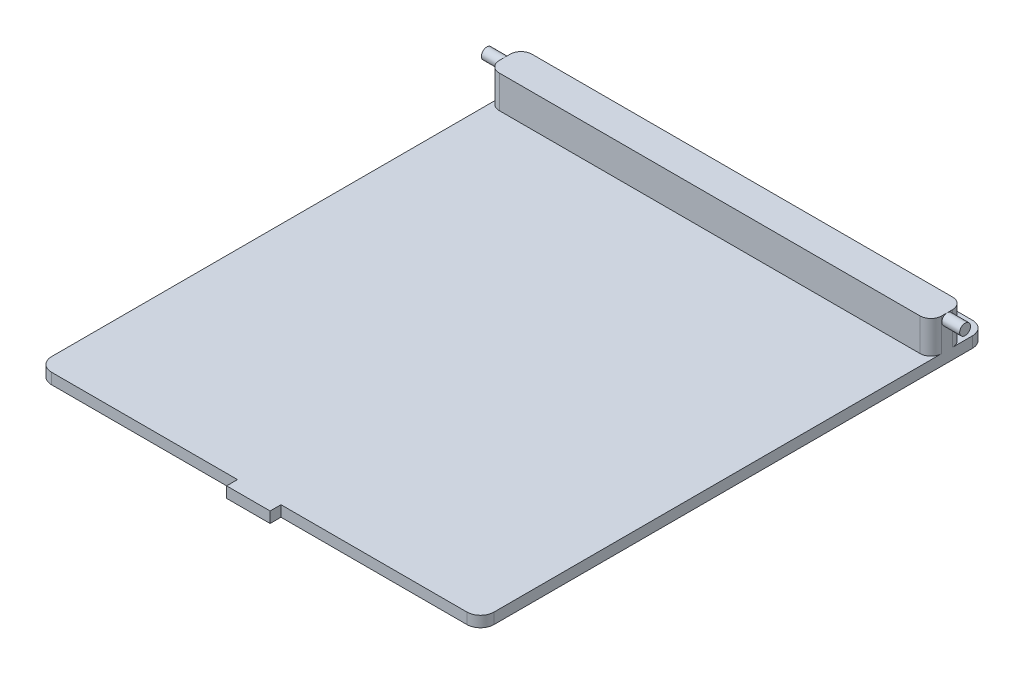
ISO-10303-21;
HEADER;
FILE_DESCRIPTION(('STEP AP214'),'2;1');
FILE_NAME('part.step','',(''),(''),'','','');
FILE_SCHEMA(('AUTOMOTIVE_DESIGN { 1 0 10303 214 1 1 1 1 }'));
ENDSEC;
DATA;
#1=APPLICATION_CONTEXT('core data for automotive mechanical design processes');
#2=APPLICATION_PROTOCOL_DEFINITION('international standard','automotive_design',2000,#1);
#3=PRODUCT_CONTEXT('',#1,'mechanical');
#4=PRODUCT('Part','Part','',(#3));
#5=PRODUCT_RELATED_PRODUCT_CATEGORY('part','',(#4));
#6=PRODUCT_DEFINITION_FORMATION('','',#4);
#7=PRODUCT_DEFINITION_CONTEXT('part definition',#1,'design');
#8=PRODUCT_DEFINITION('design','',#6,#7);
#9=PRODUCT_DEFINITION_SHAPE('','',#8);
#10=(LENGTH_UNIT() NAMED_UNIT(*) SI_UNIT(.MILLI.,.METRE.));
#11=(NAMED_UNIT(*) PLANE_ANGLE_UNIT() SI_UNIT($,.RADIAN.));
#12=(NAMED_UNIT(*) SI_UNIT($,.STERADIAN.) SOLID_ANGLE_UNIT());
#13=UNCERTAINTY_MEASURE_WITH_UNIT(LENGTH_MEASURE(1.E-05),#10,'distance_accuracy_value','');
#14=(GEOMETRIC_REPRESENTATION_CONTEXT(3) GLOBAL_UNCERTAINTY_ASSIGNED_CONTEXT((#13)) GLOBAL_UNIT_ASSIGNED_CONTEXT((#10,
#11,#12)) REPRESENTATION_CONTEXT('',''));
#15=CARTESIAN_POINT('',(0.,0.,0.));
#16=DIRECTION('',(0.,0.,1.));
#17=DIRECTION('',(1.,0.,0.));
#18=AXIS2_PLACEMENT_3D('',#15,#16,#17);
#19=CARTESIAN_POINT('',(-40.7,-5.,85.86));
#20=DIRECTION('',(0.,0.,-1.));
#21=DIRECTION('',(-1.,0.,0.));
#22=AXIS2_PLACEMENT_3D('',#19,#20,#21);
#23=PLANE('',#22);
#24=DIRECTION('',(-1.,0.,0.));
#25=VECTOR('',#24,1.);
#26=CARTESIAN_POINT('',(-40.7,-3.,85.86));
#27=LINE('',#26,#25);
#28=CARTESIAN_POINT('',(38.2,-3.,85.86));
#29=VERTEX_POINT('',#28);
#30=CARTESIAN_POINT('',(4.,-3.,85.86));
#31=VERTEX_POINT('',#30);
#32=EDGE_CURVE('E252',#29,#31,#27,.T.);
#33=ORIENTED_EDGE('',*,*,#32,.T.);
#34=DIRECTION('',(0.,-1.,0.));
#35=VECTOR('',#34,1.);
#36=CARTESIAN_POINT('',(4.,-5.,85.86));
#37=LINE('',#36,#35);
#38=CARTESIAN_POINT('',(4.,-5.,85.86));
#39=VERTEX_POINT('',#38);
#40=EDGE_CURVE('E62',#31,#39,#37,.T.);
#41=ORIENTED_EDGE('',*,*,#40,.T.);
#42=DIRECTION('',(-1.,0.,0.));
#43=VECTOR('',#42,1.);
#44=CARTESIAN_POINT('',(-40.7,-5.,85.86));
#45=LINE('',#44,#43);
#46=CARTESIAN_POINT('',(38.2,-5.,85.86));
#47=VERTEX_POINT('',#46);
#48=EDGE_CURVE('E207',#47,#39,#45,.T.);
#49=ORIENTED_EDGE('',*,*,#48,.F.);
#50=DIRECTION('',(0.,1.,0.));
#51=VECTOR('',#50,1.);
#52=CARTESIAN_POINT('',(38.2,-5.,85.86));
#53=LINE('',#52,#51);
#54=EDGE_CURVE('E373',#47,#29,#53,.T.);
#55=ORIENTED_EDGE('',*,*,#54,.T.);
#56=EDGE_LOOP('',(#33,#41,#49,#55));
#57=FACE_BOUND('',#56,.T.);
#58=ADVANCED_FACE('F39',(#57),#23,.F.);
#59=CARTESIAN_POINT('',(-40.7,3.,3.));
#60=DIRECTION('',(1.,0.,0.));
#61=DIRECTION('',(0.,0.,-1.));
#62=AXIS2_PLACEMENT_3D('',#59,#60,#61);
#63=PLANE('',#62);
#64=DIRECTION('',(0.,0.,-1.));
#65=VECTOR('',#64,1.);
#66=CARTESIAN_POINT('',(-40.7,-3.,85.86));
#67=LINE('',#66,#65);
#68=CARTESIAN_POINT('',(-40.7,-3.,-0.999999999999997));
#69=VERTEX_POINT('',#68);
#70=CARTESIAN_POINT('',(-40.7,-3.,-4.63999999999999));
#71=VERTEX_POINT('',#70);
#72=EDGE_CURVE('E254',#69,#71,#67,.T.);
#73=ORIENTED_EDGE('',*,*,#72,.T.);
#74=DIRECTION('',(0.,1.,0.));
#75=VECTOR('',#74,1.);
#76=CARTESIAN_POINT('',(-40.7,3.,-4.64000000000001));
#77=LINE('',#76,#75);
#78=CARTESIAN_POINT('',(-40.7,-5.,-4.63999999999999));
#79=VERTEX_POINT('',#78);
#80=EDGE_CURVE('E358',#71,#79,#77,.F.);
#81=ORIENTED_EDGE('',*,*,#80,.T.);
#82=DIRECTION('',(0.,0.,-1.));
#83=VECTOR('',#82,1.);
#84=CARTESIAN_POINT('',(-40.7,-5.,85.86));
#85=LINE('',#84,#83);
#86=CARTESIAN_POINT('',(-40.7,-5.,83.36));
#87=VERTEX_POINT('',#86);
#88=EDGE_CURVE('E242',#87,#79,#85,.T.);
#89=ORIENTED_EDGE('',*,*,#88,.F.);
#90=DIRECTION('',(0.,1.,0.));
#91=VECTOR('',#90,1.);
#92=CARTESIAN_POINT('',(-40.7000000000001,3.,83.36));
#93=LINE('',#92,#91);
#94=CARTESIAN_POINT('',(-40.7,-3.,83.36));
#95=VERTEX_POINT('',#94);
#96=EDGE_CURVE('E355',#87,#95,#93,.T.);
#97=ORIENTED_EDGE('',*,*,#96,.T.);
#98=CARTESIAN_POINT('',(-40.7,-3.,1.));
#99=VERTEX_POINT('',#98);
#100=EDGE_CURVE('E255',#95,#99,#67,.T.);
#101=ORIENTED_EDGE('',*,*,#100,.T.);
#102=DIRECTION('',(0.,-1.,0.));
#103=VECTOR('',#102,1.);
#104=CARTESIAN_POINT('',(-40.7,3.,1.));
#105=LINE('',#104,#103);
#106=CARTESIAN_POINT('',(-40.7,2.,1.));
#107=VERTEX_POINT('',#106);
#108=EDGE_CURVE('E321',#99,#107,#105,.F.);
#109=ORIENTED_EDGE('',*,*,#108,.T.);
#110=CARTESIAN_POINT('',(-40.7,2.,0.));
#111=DIRECTION('',(1.,0.,0.));
#112=DIRECTION('',(0.,0.,-1.));
#113=AXIS2_PLACEMENT_3D('',#110,#111,#112);
#114=CIRCLE('',#113,1.);
#115=CARTESIAN_POINT('',(-40.7,2.,-0.999999999999996));
#116=VERTEX_POINT('',#115);
#117=EDGE_CURVE('E274',#116,#107,#114,.F.);
#118=ORIENTED_EDGE('',*,*,#117,.F.);
#119=DIRECTION('',(0.,-1.,0.));
#120=VECTOR('',#119,1.);
#121=CARTESIAN_POINT('',(-40.7,3.,-0.999999999999997));
#122=LINE('',#121,#120);
#123=EDGE_CURVE('E317',#116,#69,#122,.T.);
#124=ORIENTED_EDGE('',*,*,#123,.T.);
#125=EDGE_LOOP('',(#73,#81,#89,#97,#101,#109,#118,#124));
#126=FACE_BOUND('',#125,.T.);
#127=ADVANCED_FACE('F460',(#126),#63,.F.);
#128=CARTESIAN_POINT('',(-40.7,3.,0.));
#129=VERTEX_POINT('',#128);
#130=EDGE_CURVE('E275',#107,#129,#114,.F.);
#131=ORIENTED_EDGE('',*,*,#130,.F.);
#132=CARTESIAN_POINT('',(-40.7,3.,1.));
#133=VERTEX_POINT('',#132);
#134=EDGE_CURVE('E320',#107,#133,#105,.F.);
#135=ORIENTED_EDGE('',*,*,#134,.T.);
#136=DIRECTION('',(0.,0.,1.));
#137=VECTOR('',#136,1.);
#138=CARTESIAN_POINT('',(-40.7,3.,3.));
#139=LINE('',#138,#137);
#140=EDGE_CURVE('E280',#129,#133,#139,.T.);
#141=ORIENTED_EDGE('',*,*,#140,.F.);
#142=EDGE_LOOP('',(#131,#135,#141));
#143=FACE_BOUND('',#142,.T.);
#144=ADVANCED_FACE('F483',(#143),#63,.F.);
#145=CARTESIAN_POINT('',(40.7,3.,3.));
#146=DIRECTION('',(-1.,0.,0.));
#147=DIRECTION('',(0.,0.,1.));
#148=AXIS2_PLACEMENT_3D('',#145,#146,#147);
#149=PLANE('',#148);
#150=DIRECTION('',(0.,0.,1.));
#151=VECTOR('',#150,1.);
#152=CARTESIAN_POINT('',(40.7,-3.,85.86));
#153=LINE('',#152,#151);
#154=CARTESIAN_POINT('',(40.7,-3.,0.999999999999996));
#155=VERTEX_POINT('',#154);
#156=CARTESIAN_POINT('',(40.7,-3.,83.36));
#157=VERTEX_POINT('',#156);
#158=EDGE_CURVE('E235',#155,#157,#153,.T.);
#159=ORIENTED_EDGE('',*,*,#158,.T.);
#160=DIRECTION('',(0.,1.,0.));
#161=VECTOR('',#160,1.);
#162=CARTESIAN_POINT('',(40.7,3.,83.36));
#163=LINE('',#162,#161);
#164=CARTESIAN_POINT('',(40.7,-5.,83.36));
#165=VERTEX_POINT('',#164);
#166=EDGE_CURVE('E11',#157,#165,#163,.F.);
#167=ORIENTED_EDGE('',*,*,#166,.T.);
#168=DIRECTION('',(0.,0.,1.));
#169=VECTOR('',#168,1.);
#170=CARTESIAN_POINT('',(40.7,-5.,85.86));
#171=LINE('',#170,#169);
#172=CARTESIAN_POINT('',(40.7,-5.,-4.63999999999998));
#173=VERTEX_POINT('',#172);
#174=EDGE_CURVE('E236',#173,#165,#171,.T.);
#175=ORIENTED_EDGE('',*,*,#174,.F.);
#176=DIRECTION('',(0.,1.,0.));
#177=VECTOR('',#176,1.);
#178=CARTESIAN_POINT('',(40.7,3.,-4.64000000000001));
#179=LINE('',#178,#177);
#180=CARTESIAN_POINT('',(40.7,-3.,-4.63999999999998));
#181=VERTEX_POINT('',#180);
#182=EDGE_CURVE('E47',#173,#181,#179,.T.);
#183=ORIENTED_EDGE('',*,*,#182,.T.);
#184=CARTESIAN_POINT('',(40.7,-3.,-1.));
#185=VERTEX_POINT('',#184);
#186=EDGE_CURVE('E249',#181,#185,#153,.T.);
#187=ORIENTED_EDGE('',*,*,#186,.T.);
#188=DIRECTION('',(0.,-1.,0.));
#189=VECTOR('',#188,1.);
#190=CARTESIAN_POINT('',(40.7,3.,-1.));
#191=LINE('',#190,#189);
#192=CARTESIAN_POINT('',(40.7,2.,-1.));
#193=VERTEX_POINT('',#192);
#194=EDGE_CURVE('E334',#185,#193,#191,.F.);
#195=ORIENTED_EDGE('',*,*,#194,.T.);
#196=CARTESIAN_POINT('',(40.7,2.,0.));
#197=DIRECTION('',(-1.,0.,0.));
#198=DIRECTION('',(0.,0.,1.));
#199=AXIS2_PLACEMENT_3D('',#196,#197,#198);
#200=CIRCLE('',#199,1.);
#201=CARTESIAN_POINT('',(40.7,2.,0.999999999999995));
#202=VERTEX_POINT('',#201);
#203=EDGE_CURVE('E269',#202,#193,#200,.F.);
#204=ORIENTED_EDGE('',*,*,#203,.F.);
#205=DIRECTION('',(0.,-1.,0.));
#206=VECTOR('',#205,1.);
#207=CARTESIAN_POINT('',(40.7,3.,0.999999999999996));
#208=LINE('',#207,#206);
#209=EDGE_CURVE('E337',#202,#155,#208,.T.);
#210=ORIENTED_EDGE('',*,*,#209,.T.);
#211=EDGE_LOOP('',(#159,#167,#175,#183,#187,#195,#204,#210));
#212=FACE_BOUND('',#211,.T.);
#213=ADVANCED_FACE('F383',(#212),#149,.F.);
#214=CARTESIAN_POINT('',(40.7,3.,0.));
#215=VERTEX_POINT('',#214);
#216=EDGE_CURVE('E270',#193,#215,#200,.F.);
#217=ORIENTED_EDGE('',*,*,#216,.F.);
#218=CARTESIAN_POINT('',(40.7,3.,-1.));
#219=VERTEX_POINT('',#218);
#220=EDGE_CURVE('E333',#193,#219,#191,.F.);
#221=ORIENTED_EDGE('',*,*,#220,.T.);
#222=DIRECTION('',(0.,0.,-1.));
#223=VECTOR('',#222,1.);
#224=CARTESIAN_POINT('',(40.7,3.,3.));
#225=LINE('',#224,#223);
#226=EDGE_CURVE('E284',#215,#219,#225,.T.);
#227=ORIENTED_EDGE('',*,*,#226,.F.);
#228=EDGE_LOOP('',(#217,#221,#227));
#229=FACE_BOUND('',#228,.T.);
#230=ADVANCED_FACE('F475',(#229),#149,.F.);
#231=EDGE_CURVE('E271',#129,#116,#114,.F.);
#232=ORIENTED_EDGE('',*,*,#231,.F.);
#233=CARTESIAN_POINT('',(-40.7,3.,-0.999999999999997));
#234=VERTEX_POINT('',#233);
#235=EDGE_CURVE('E276',#234,#129,#139,.T.);
#236=ORIENTED_EDGE('',*,*,#235,.F.);
#237=EDGE_CURVE('E318',#234,#116,#122,.T.);
#238=ORIENTED_EDGE('',*,*,#237,.T.);
#239=EDGE_LOOP('',(#232,#236,#238));
#240=FACE_BOUND('',#239,.T.);
#241=ADVANCED_FACE('F411',(#240),#63,.F.);
#242=CARTESIAN_POINT('',(40.7,3.,3.));
#243=DIRECTION('',(0.,0.,-1.));
#244=DIRECTION('',(-1.,0.,0.));
#245=AXIS2_PLACEMENT_3D('',#242,#243,#244);
#246=PLANE('',#245);
#247=DIRECTION('',(1.,0.,0.));
#248=VECTOR('',#247,1.);
#249=CARTESIAN_POINT('',(40.7,3.,3.));
#250=LINE('',#249,#248);
#251=CARTESIAN_POINT('',(-38.7,3.,3.));
#252=VERTEX_POINT('',#251);
#253=CARTESIAN_POINT('',(38.7,3.,3.));
#254=VERTEX_POINT('',#253);
#255=EDGE_CURVE('E279',#252,#254,#250,.T.);
#256=ORIENTED_EDGE('',*,*,#255,.F.);
#257=DIRECTION('',(0.,-1.,0.));
#258=VECTOR('',#257,1.);
#259=CARTESIAN_POINT('',(-38.7,3.,3.));
#260=LINE('',#259,#258);
#261=CARTESIAN_POINT('',(-38.7,-3.,3.));
#262=VERTEX_POINT('',#261);
#263=EDGE_CURVE('E301',#252,#262,#260,.T.);
#264=ORIENTED_EDGE('',*,*,#263,.T.);
#265=DIRECTION('',(1.,0.,0.));
#266=VECTOR('',#265,1.);
#267=CARTESIAN_POINT('',(40.7,-3.,3.));
#268=LINE('',#267,#266);
#269=CARTESIAN_POINT('',(38.7,-3.,3.));
#270=VERTEX_POINT('',#269);
#271=EDGE_CURVE('E293',#262,#270,#268,.T.);
#272=ORIENTED_EDGE('',*,*,#271,.T.);
#273=DIRECTION('',(0.,-1.,0.));
#274=VECTOR('',#273,1.);
#275=CARTESIAN_POINT('',(38.7,3.,3.));
#276=LINE('',#275,#274);
#277=EDGE_CURVE('E292',#270,#254,#276,.F.);
#278=ORIENTED_EDGE('',*,*,#277,.T.);
#279=EDGE_LOOP('',(#256,#264,#272,#278));
#280=FACE_BOUND('',#279,.T.);
#281=ADVANCED_FACE('F468',(#280),#246,.F.);
#282=EDGE_CURVE('E263',#215,#202,#200,.F.);
#283=ORIENTED_EDGE('',*,*,#282,.F.);
#284=CARTESIAN_POINT('',(40.7,3.,0.999999999999996));
#285=VERTEX_POINT('',#284);
#286=EDGE_CURVE('E285',#285,#215,#225,.T.);
#287=ORIENTED_EDGE('',*,*,#286,.F.);
#288=EDGE_CURVE('E338',#285,#202,#208,.T.);
#289=ORIENTED_EDGE('',*,*,#288,.T.);
#290=EDGE_LOOP('',(#283,#287,#289));
#291=FACE_BOUND('',#290,.T.);
#292=ADVANCED_FACE('F471',(#291),#149,.F.);
#293=CARTESIAN_POINT('',(40.7,3.,-3.));
#294=DIRECTION('',(0.,0.,1.));
#295=DIRECTION('',(1.,0.,0.));
#296=AXIS2_PLACEMENT_3D('',#293,#294,#295);
#297=PLANE('',#296);
#298=DIRECTION('',(-1.,0.,0.));
#299=VECTOR('',#298,1.);
#300=CARTESIAN_POINT('',(40.7,3.,-3.));
#301=LINE('',#300,#299);
#302=CARTESIAN_POINT('',(38.7,3.,-3.));
#303=VERTEX_POINT('',#302);
#304=CARTESIAN_POINT('',(-38.7,3.,-2.99999999999999));
#305=VERTEX_POINT('',#304);
#306=EDGE_CURVE('E289',#303,#305,#301,.T.);
#307=ORIENTED_EDGE('',*,*,#306,.F.);
#308=DIRECTION('',(0.,-1.,0.));
#309=VECTOR('',#308,1.);
#310=CARTESIAN_POINT('',(38.7,3.,-3.));
#311=LINE('',#310,#309);
#312=CARTESIAN_POINT('',(38.7,-3.,-3.));
#313=VERTEX_POINT('',#312);
#314=EDGE_CURVE('E343',#303,#313,#311,.T.);
#315=ORIENTED_EDGE('',*,*,#314,.T.);
#316=DIRECTION('',(-1.,0.,0.));
#317=VECTOR('',#316,1.);
#318=CARTESIAN_POINT('',(40.7,-3.,-3.));
#319=LINE('',#318,#317);
#320=CARTESIAN_POINT('',(-38.7,-3.,-2.99999999999999));
#321=VERTEX_POINT('',#320);
#322=EDGE_CURVE('E297',#313,#321,#319,.T.);
#323=ORIENTED_EDGE('',*,*,#322,.T.);
#324=DIRECTION('',(0.,-1.,0.));
#325=VECTOR('',#324,1.);
#326=CARTESIAN_POINT('',(-38.7,3.,-2.99999999999999));
#327=LINE('',#326,#325);
#328=EDGE_CURVE('E341',#321,#305,#327,.F.);
#329=ORIENTED_EDGE('',*,*,#328,.T.);
#330=EDGE_LOOP('',(#307,#315,#323,#329));
#331=FACE_BOUND('',#330,.T.);
#332=ADVANCED_FACE('F398',(#331),#297,.F.);
#333=CARTESIAN_POINT('',(0.,3.,0.));
#334=DIRECTION('',(0.,1.,0.));
#335=DIRECTION('',(0.,0.,1.));
#336=AXIS2_PLACEMENT_3D('',#333,#334,#335);
#337=PLANE('',#336);
#338=ORIENTED_EDGE('',*,*,#286,.T.);
#339=ORIENTED_EDGE('',*,*,#226,.T.);
#340=CARTESIAN_POINT('',(38.7,3.,-1.));
#341=DIRECTION('',(0.,1.,0.));
#342=DIRECTION('',(0.,0.,1.));
#343=AXIS2_PLACEMENT_3D('',#340,#341,#342);
#344=CIRCLE('',#343,2.);
#345=EDGE_CURVE('E326',#219,#303,#344,.T.);
#346=ORIENTED_EDGE('',*,*,#345,.T.);
#347=ORIENTED_EDGE('',*,*,#306,.T.);
#348=CARTESIAN_POINT('',(-38.7,3.,-0.999999999999994));
#349=DIRECTION('',(0.,1.,0.));
#350=DIRECTION('',(0.,0.,1.));
#351=AXIS2_PLACEMENT_3D('',#348,#349,#350);
#352=CIRCLE('',#351,2.);
#353=EDGE_CURVE('E324',#305,#234,#352,.T.);
#354=ORIENTED_EDGE('',*,*,#353,.T.);
#355=ORIENTED_EDGE('',*,*,#235,.T.);
#356=ORIENTED_EDGE('',*,*,#140,.T.);
#357=CARTESIAN_POINT('',(-38.7,3.,1.));
#358=DIRECTION('',(0.,1.,0.));
#359=DIRECTION('',(0.,0.,1.));
#360=AXIS2_PLACEMENT_3D('',#357,#358,#359);
#361=CIRCLE('',#360,2.);
#362=EDGE_CURVE('E331',#133,#252,#361,.T.);
#363=ORIENTED_EDGE('',*,*,#362,.T.);
#364=ORIENTED_EDGE('',*,*,#255,.T.);
#365=CARTESIAN_POINT('',(38.7,3.,0.999999999999996));
#366=DIRECTION('',(0.,1.,0.));
#367=DIRECTION('',(0.,0.,1.));
#368=AXIS2_PLACEMENT_3D('',#365,#366,#367);
#369=CIRCLE('',#368,2.);
#370=EDGE_CURVE('E328',#254,#285,#369,.T.);
#371=ORIENTED_EDGE('',*,*,#370,.T.);
#372=EDGE_LOOP('',(#338,#339,#346,#347,#354,#355,#356,#363,#364,#371));
#373=FACE_BOUND('',#372,.T.);
#374=ADVANCED_FACE('F402',(#373),#337,.T.);
#375=CARTESIAN_POINT('',(-38.7,3.,1.));
#376=DIRECTION('',(0.,-1.,0.));
#377=DIRECTION('',(0.,0.,-1.));
#378=AXIS2_PLACEMENT_3D('',#375,#376,#377);
#379=CYLINDRICAL_SURFACE('',#378,2.);
#380=ORIENTED_EDGE('',*,*,#362,.F.);
#381=ORIENTED_EDGE('',*,*,#134,.F.);
#382=ORIENTED_EDGE('',*,*,#108,.F.);
#383=CARTESIAN_POINT('',(-38.7,-3.,1.));
#384=DIRECTION('',(0.,1.,0.));
#385=DIRECTION('',(0.,0.,1.));
#386=AXIS2_PLACEMENT_3D('',#383,#384,#385);
#387=CIRCLE('',#386,2.);
#388=EDGE_CURVE('E314',#262,#99,#387,.F.);
#389=ORIENTED_EDGE('',*,*,#388,.F.);
#390=ORIENTED_EDGE('',*,*,#263,.F.);
#391=EDGE_LOOP('',(#380,#381,#382,#389,#390));
#392=FACE_BOUND('',#391,.T.);
#393=ADVANCED_FACE('F465',(#392),#379,.T.);
#394=CARTESIAN_POINT('',(38.7,3.,0.999999999999996));
#395=DIRECTION('',(0.,-1.,0.));
#396=DIRECTION('',(0.,0.,-1.));
#397=AXIS2_PLACEMENT_3D('',#394,#395,#396);
#398=CYLINDRICAL_SURFACE('',#397,2.);
#399=ORIENTED_EDGE('',*,*,#370,.F.);
#400=ORIENTED_EDGE('',*,*,#277,.F.);
#401=CARTESIAN_POINT('',(38.7,-3.,0.999999999999996));
#402=DIRECTION('',(0.,1.,0.));
#403=DIRECTION('',(0.,0.,1.));
#404=AXIS2_PLACEMENT_3D('',#401,#402,#403);
#405=CIRCLE('',#404,2.);
#406=EDGE_CURVE('E310',#155,#270,#405,.F.);
#407=ORIENTED_EDGE('',*,*,#406,.F.);
#408=ORIENTED_EDGE('',*,*,#209,.F.);
#409=ORIENTED_EDGE('',*,*,#288,.F.);
#410=EDGE_LOOP('',(#399,#400,#407,#408,#409));
#411=FACE_BOUND('',#410,.T.);
#412=ADVANCED_FACE('F436',(#411),#398,.T.);
#413=CARTESIAN_POINT('',(38.7,3.,-1.));
#414=DIRECTION('',(0.,-1.,0.));
#415=DIRECTION('',(0.,0.,-1.));
#416=AXIS2_PLACEMENT_3D('',#413,#414,#415);
#417=CYLINDRICAL_SURFACE('',#416,2.);
#418=ORIENTED_EDGE('',*,*,#345,.F.);
#419=ORIENTED_EDGE('',*,*,#220,.F.);
#420=ORIENTED_EDGE('',*,*,#194,.F.);
#421=CARTESIAN_POINT('',(38.7,-3.,-1.));
#422=DIRECTION('',(0.,1.,0.));
#423=DIRECTION('',(0.,0.,1.));
#424=AXIS2_PLACEMENT_3D('',#421,#422,#423);
#425=CIRCLE('',#424,2.);
#426=EDGE_CURVE('E307',#313,#185,#425,.F.);
#427=ORIENTED_EDGE('',*,*,#426,.F.);
#428=ORIENTED_EDGE('',*,*,#314,.F.);
#429=EDGE_LOOP('',(#418,#419,#420,#427,#428));
#430=FACE_BOUND('',#429,.T.);
#431=ADVANCED_FACE('F394',(#430),#417,.T.);
#432=CARTESIAN_POINT('',(-38.7,3.,-0.999999999999994));
#433=DIRECTION('',(0.,-1.,0.));
#434=DIRECTION('',(0.,0.,-1.));
#435=AXIS2_PLACEMENT_3D('',#432,#433,#434);
#436=CYLINDRICAL_SURFACE('',#435,2.);
#437=ORIENTED_EDGE('',*,*,#353,.F.);
#438=ORIENTED_EDGE('',*,*,#328,.F.);
#439=CARTESIAN_POINT('',(-38.7,-3.,-0.999999999999994));
#440=DIRECTION('',(0.,1.,0.));
#441=DIRECTION('',(0.,0.,1.));
#442=AXIS2_PLACEMENT_3D('',#439,#440,#441);
#443=CIRCLE('',#442,2.);
#444=EDGE_CURVE('E304',#69,#321,#443,.F.);
#445=ORIENTED_EDGE('',*,*,#444,.F.);
#446=ORIENTED_EDGE('',*,*,#123,.F.);
#447=ORIENTED_EDGE('',*,*,#237,.F.);
#448=EDGE_LOOP('',(#437,#438,#445,#446,#447));
#449=FACE_BOUND('',#448,.T.);
#450=ADVANCED_FACE('F406',(#449),#436,.T.);
#451=CARTESIAN_POINT('',(44.,2.,0.));
#452=DIRECTION('',(1.,0.,0.));
#453=DIRECTION('',(0.,0.,-1.));
#454=AXIS2_PLACEMENT_3D('',#451,#452,#453);
#455=PLANE('',#454);
#456=CARTESIAN_POINT('',(44.,2.,0.));
#457=DIRECTION('',(1.,0.,0.));
#458=DIRECTION('',(0.,0.,-1.));
#459=AXIS2_PLACEMENT_3D('',#456,#457,#458);
#460=CIRCLE('',#459,1.);
#461=CARTESIAN_POINT('',(44.,2.,-1.));
#462=VERTEX_POINT('',#461);
#463=EDGE_CURVE('E259',#462,#462,#460,.T.);
#464=ORIENTED_EDGE('',*,*,#463,.T.);
#465=EDGE_LOOP('',(#464));
#466=FACE_BOUND('',#465,.T.);
#467=ADVANCED_FACE('F620',(#466),#455,.T.);
#468=CARTESIAN_POINT('',(44.,2.,0.));
#469=DIRECTION('',(-1.,0.,0.));
#470=DIRECTION('',(0.,0.,1.));
#471=AXIS2_PLACEMENT_3D('',#468,#469,#470);
#472=CYLINDRICAL_SURFACE('',#471,1.);
#473=ORIENTED_EDGE('',*,*,#463,.F.);
#474=EDGE_LOOP('',(#473));
#475=FACE_BOUND('',#474,.T.);
#476=ORIENTED_EDGE('',*,*,#203,.T.);
#477=ORIENTED_EDGE('',*,*,#216,.T.);
#478=ORIENTED_EDGE('',*,*,#282,.T.);
#479=EDGE_LOOP('',(#476,#477,#478));
#480=FACE_BOUND('',#479,.T.);
#481=ADVANCED_FACE('F427',(#475,#480),#472,.T.);
#482=CARTESIAN_POINT('',(-44.,2.,0.));
#483=DIRECTION('',(1.,0.,0.));
#484=DIRECTION('',(0.,0.,-1.));
#485=AXIS2_PLACEMENT_3D('',#482,#483,#484);
#486=CIRCLE('',#485,1.);
#487=CARTESIAN_POINT('',(-44.,2.,-1.));
#488=VERTEX_POINT('',#487);
#489=EDGE_CURVE('E248',#488,#488,#486,.T.);
#490=ORIENTED_EDGE('',*,*,#489,.T.);
#491=EDGE_LOOP('',(#490));
#492=FACE_BOUND('',#491,.T.);
#493=ORIENTED_EDGE('',*,*,#117,.T.);
#494=ORIENTED_EDGE('',*,*,#130,.T.);
#495=ORIENTED_EDGE('',*,*,#231,.T.);
#496=EDGE_LOOP('',(#493,#494,#495));
#497=FACE_BOUND('',#496,.T.);
#498=ADVANCED_FACE('F417',(#492,#497),#472,.T.);
#499=CARTESIAN_POINT('',(-44.,2.,0.));
#500=DIRECTION('',(1.,0.,0.));
#501=DIRECTION('',(0.,0.,-1.));
#502=AXIS2_PLACEMENT_3D('',#499,#500,#501);
#503=PLANE('',#502);
#504=ORIENTED_EDGE('',*,*,#489,.F.);
#505=EDGE_LOOP('',(#504));
#506=FACE_BOUND('',#505,.T.);
#507=ADVANCED_FACE('F501',(#506),#503,.F.);
#508=CARTESIAN_POINT('',(0.,-3.,0.));
#509=DIRECTION('',(0.,-1.,0.));
#510=DIRECTION('',(0.,0.,-1.));
#511=AXIS2_PLACEMENT_3D('',#508,#509,#510);
#512=PLANE('',#511);
#513=DIRECTION('',(1.,0.,0.));
#514=VECTOR('',#513,1.);
#515=CARTESIAN_POINT('',(-40.7,-3.,-7.14000000000001));
#516=LINE('',#515,#514);
#517=CARTESIAN_POINT('',(-38.2,-3.,-7.14000000000001));
#518=VERTEX_POINT('',#517);
#519=CARTESIAN_POINT('',(38.2,-3.,-7.14000000000001));
#520=VERTEX_POINT('',#519);
#521=EDGE_CURVE('E240',#518,#520,#516,.T.);
#522=ORIENTED_EDGE('',*,*,#521,.F.);
#523=CARTESIAN_POINT('',(-38.2,-3.,-4.64000000000001));
#524=DIRECTION('',(0.,-1.,0.));
#525=DIRECTION('',(0.,0.,-1.));
#526=AXIS2_PLACEMENT_3D('',#523,#524,#525);
#527=CIRCLE('',#526,2.5);
#528=EDGE_CURVE('E353',#518,#71,#527,.F.);
#529=ORIENTED_EDGE('',*,*,#528,.T.);
#530=ORIENTED_EDGE('',*,*,#72,.F.);
#531=ORIENTED_EDGE('',*,*,#444,.T.);
#532=ORIENTED_EDGE('',*,*,#322,.F.);
#533=ORIENTED_EDGE('',*,*,#426,.T.);
#534=ORIENTED_EDGE('',*,*,#186,.F.);
#535=CARTESIAN_POINT('',(38.2,-3.,-4.64000000000001));
#536=DIRECTION('',(0.,-1.,0.));
#537=DIRECTION('',(0.,0.,-1.));
#538=AXIS2_PLACEMENT_3D('',#535,#536,#537);
#539=CIRCLE('',#538,2.5);
#540=EDGE_CURVE('E351',#181,#520,#539,.F.);
#541=ORIENTED_EDGE('',*,*,#540,.T.);
#542=EDGE_LOOP('',(#522,#529,#530,#531,#532,#533,#534,#541));
#543=FACE_BOUND('',#542,.T.);
#544=ADVANCED_FACE('F389',(#543),#512,.F.);
#545=CARTESIAN_POINT('',(-4.,-5.,85.86));
#546=VERTEX_POINT('',#545);
#547=CARTESIAN_POINT('',(-38.2000000000001,-5.,85.86));
#548=VERTEX_POINT('',#547);
#549=EDGE_CURVE('E54',#546,#548,#45,.T.);
#550=ORIENTED_EDGE('',*,*,#549,.F.);
#551=DIRECTION('',(0.,1.,0.));
#552=VECTOR('',#551,1.);
#553=CARTESIAN_POINT('',(-4.,-5.,85.86));
#554=LINE('',#553,#552);
#555=CARTESIAN_POINT('',(-4.,-3.,85.86));
#556=VERTEX_POINT('',#555);
#557=EDGE_CURVE('E232',#546,#556,#554,.T.);
#558=ORIENTED_EDGE('',*,*,#557,.T.);
#559=CARTESIAN_POINT('',(-38.2000000000001,-3.,85.86));
#560=VERTEX_POINT('',#559);
#561=EDGE_CURVE('E251',#556,#560,#27,.T.);
#562=ORIENTED_EDGE('',*,*,#561,.T.);
#563=DIRECTION('',(0.,1.,0.));
#564=VECTOR('',#563,1.);
#565=CARTESIAN_POINT('',(-38.2000000000001,-5.,85.86));
#566=LINE('',#565,#564);
#567=EDGE_CURVE('E376',#560,#548,#566,.F.);
#568=ORIENTED_EDGE('',*,*,#567,.T.);
#569=EDGE_LOOP('',(#550,#558,#562,#568));
#570=FACE_BOUND('',#569,.T.);
#571=ADVANCED_FACE('F453',(#570),#23,.F.);
#572=CARTESIAN_POINT('',(-40.7,-5.,-7.14000000000001));
#573=DIRECTION('',(0.,0.,1.));
#574=DIRECTION('',(1.,0.,0.));
#575=AXIS2_PLACEMENT_3D('',#572,#573,#574);
#576=PLANE('',#575);
#577=DIRECTION('',(1.,0.,0.));
#578=VECTOR('',#577,1.);
#579=CARTESIAN_POINT('',(-40.7,-5.,-7.14000000000001));
#580=LINE('',#579,#578);
#581=CARTESIAN_POINT('',(-38.2,-5.,-7.14000000000001));
#582=VERTEX_POINT('',#581);
#583=CARTESIAN_POINT('',(38.2,-5.,-7.14000000000001));
#584=VERTEX_POINT('',#583);
#585=EDGE_CURVE('E245',#582,#584,#580,.T.);
#586=ORIENTED_EDGE('',*,*,#585,.F.);
#587=DIRECTION('',(0.,1.,0.));
#588=VECTOR('',#587,1.);
#589=CARTESIAN_POINT('',(-38.2,-5.,-7.14000000000001));
#590=LINE('',#589,#588);
#591=EDGE_CURVE('E348',#582,#518,#590,.T.);
#592=ORIENTED_EDGE('',*,*,#591,.T.);
#593=ORIENTED_EDGE('',*,*,#521,.T.);
#594=DIRECTION('',(0.,1.,0.));
#595=VECTOR('',#594,1.);
#596=CARTESIAN_POINT('',(38.2,-5.,-7.14000000000001));
#597=LINE('',#596,#595);
#598=EDGE_CURVE('E346',#520,#584,#597,.F.);
#599=ORIENTED_EDGE('',*,*,#598,.T.);
#600=EDGE_LOOP('',(#586,#592,#593,#599));
#601=FACE_BOUND('',#600,.T.);
#602=ADVANCED_FACE('F495',(#601),#576,.F.);
#603=CARTESIAN_POINT('',(0.,-5.,0.));
#604=DIRECTION('',(0.,-1.,0.));
#605=DIRECTION('',(0.,0.,-1.));
#606=AXIS2_PLACEMENT_3D('',#603,#604,#605);
#607=PLANE('',#606);
#608=ORIENTED_EDGE('',*,*,#48,.T.);
#609=DIRECTION('',(0.,0.,1.));
#610=VECTOR('',#609,1.);
#611=CARTESIAN_POINT('',(4.,-5.,83.8600000000006));
#612=LINE('',#611,#610);
#613=CARTESIAN_POINT('',(4.,-5.,87.8600000000006));
#614=VERTEX_POINT('',#613);
#615=EDGE_CURVE('E201',#39,#614,#612,.T.);
#616=ORIENTED_EDGE('',*,*,#615,.T.);
#617=DIRECTION('',(-1.,0.,0.));
#618=VECTOR('',#617,1.);
#619=CARTESIAN_POINT('',(-4.,-5.,87.8600000000006));
#620=LINE('',#619,#618);
#621=CARTESIAN_POINT('',(-4.,-5.,87.8600000000006));
#622=VERTEX_POINT('',#621);
#623=EDGE_CURVE('E206',#614,#622,#620,.T.);
#624=ORIENTED_EDGE('',*,*,#623,.T.);
#625=DIRECTION('',(0.,0.,-1.));
#626=VECTOR('',#625,1.);
#627=CARTESIAN_POINT('',(-4.,-5.,83.8600000000006));
#628=LINE('',#627,#626);
#629=EDGE_CURVE('E219',#622,#546,#628,.T.);
#630=ORIENTED_EDGE('',*,*,#629,.T.);
#631=ORIENTED_EDGE('',*,*,#549,.T.);
#632=CARTESIAN_POINT('',(-38.2000000000001,-5.,83.36));
#633=DIRECTION('',(0.,-1.,0.));
#634=DIRECTION('',(0.,0.,-1.));
#635=AXIS2_PLACEMENT_3D('',#632,#633,#634);
#636=CIRCLE('',#635,2.5);
#637=EDGE_CURVE('E364',#548,#87,#636,.T.);
#638=ORIENTED_EDGE('',*,*,#637,.T.);
#639=ORIENTED_EDGE('',*,*,#88,.T.);
#640=CARTESIAN_POINT('',(-38.2,-5.,-4.64000000000001));
#641=DIRECTION('',(0.,-1.,0.));
#642=DIRECTION('',(0.,0.,-1.));
#643=AXIS2_PLACEMENT_3D('',#640,#641,#642);
#644=CIRCLE('',#643,2.5);
#645=EDGE_CURVE('E366',#79,#582,#644,.T.);
#646=ORIENTED_EDGE('',*,*,#645,.T.);
#647=ORIENTED_EDGE('',*,*,#585,.T.);
#648=CARTESIAN_POINT('',(38.2,-5.,-4.64000000000001));
#649=DIRECTION('',(0.,-1.,0.));
#650=DIRECTION('',(0.,0.,-1.));
#651=AXIS2_PLACEMENT_3D('',#648,#649,#650);
#652=CIRCLE('',#651,2.5);
#653=EDGE_CURVE('E360',#584,#173,#652,.T.);
#654=ORIENTED_EDGE('',*,*,#653,.T.);
#655=ORIENTED_EDGE('',*,*,#174,.T.);
#656=CARTESIAN_POINT('',(38.2,-5.,83.36));
#657=DIRECTION('',(0.,-1.,0.));
#658=DIRECTION('',(0.,0.,-1.));
#659=AXIS2_PLACEMENT_3D('',#656,#657,#658);
#660=CIRCLE('',#659,2.5);
#661=EDGE_CURVE('E362',#165,#47,#660,.T.);
#662=ORIENTED_EDGE('',*,*,#661,.T.);
#663=EDGE_LOOP('',(#608,#616,#624,#630,#631,#638,#639,#646,#647,#654,#655,#662));
#664=FACE_BOUND('',#663,.T.);
#665=ADVANCED_FACE('F203',(#664),#607,.T.);
#666=ORIENTED_EDGE('',*,*,#561,.F.);
#667=DIRECTION('',(0.,0.,1.));
#668=VECTOR('',#667,1.);
#669=CARTESIAN_POINT('',(-4.,-3.,83.8600000000006));
#670=LINE('',#669,#668);
#671=CARTESIAN_POINT('',(-4.,-3.,87.8600000000006));
#672=VERTEX_POINT('',#671);
#673=EDGE_CURVE('E228',#556,#672,#670,.T.);
#674=ORIENTED_EDGE('',*,*,#673,.T.);
#675=DIRECTION('',(1.,0.,0.));
#676=VECTOR('',#675,1.);
#677=CARTESIAN_POINT('',(-4.,-3.,87.8600000000006));
#678=LINE('',#677,#676);
#679=CARTESIAN_POINT('',(4.,-3.,87.8600000000006));
#680=VERTEX_POINT('',#679);
#681=EDGE_CURVE('E230',#672,#680,#678,.T.);
#682=ORIENTED_EDGE('',*,*,#681,.T.);
#683=DIRECTION('',(0.,0.,-1.));
#684=VECTOR('',#683,1.);
#685=CARTESIAN_POINT('',(4.,-3.,83.8600000000006));
#686=LINE('',#685,#684);
#687=EDGE_CURVE('E215',#680,#31,#686,.T.);
#688=ORIENTED_EDGE('',*,*,#687,.T.);
#689=ORIENTED_EDGE('',*,*,#32,.F.);
#690=CARTESIAN_POINT('',(38.2,-3.,83.36));
#691=DIRECTION('',(0.,-1.,0.));
#692=DIRECTION('',(0.,0.,-1.));
#693=AXIS2_PLACEMENT_3D('',#690,#691,#692);
#694=CIRCLE('',#693,2.5);
#695=EDGE_CURVE('E368',#29,#157,#694,.F.);
#696=ORIENTED_EDGE('',*,*,#695,.T.);
#697=ORIENTED_EDGE('',*,*,#158,.F.);
#698=ORIENTED_EDGE('',*,*,#406,.T.);
#699=ORIENTED_EDGE('',*,*,#271,.F.);
#700=ORIENTED_EDGE('',*,*,#388,.T.);
#701=ORIENTED_EDGE('',*,*,#100,.F.);
#702=CARTESIAN_POINT('',(-38.2000000000001,-3.,83.36));
#703=DIRECTION('',(0.,-1.,0.));
#704=DIRECTION('',(0.,0.,-1.));
#705=AXIS2_PLACEMENT_3D('',#702,#703,#704);
#706=CIRCLE('',#705,2.5);
#707=EDGE_CURVE('E370',#95,#560,#706,.F.);
#708=ORIENTED_EDGE('',*,*,#707,.T.);
#709=EDGE_LOOP('',(#666,#674,#682,#688,#689,#696,#697,#698,#699,#700,#701,#708));
#710=FACE_BOUND('',#709,.T.);
#711=ADVANCED_FACE('F439',(#710),#512,.F.);
#712=CARTESIAN_POINT('',(-38.2,-5.,-4.64000000000001));
#713=DIRECTION('',(0.,1.,0.));
#714=DIRECTION('',(0.,0.,1.));
#715=AXIS2_PLACEMENT_3D('',#712,#713,#714);
#716=CYLINDRICAL_SURFACE('',#715,2.5);
#717=ORIENTED_EDGE('',*,*,#645,.F.);
#718=ORIENTED_EDGE('',*,*,#80,.F.);
#719=ORIENTED_EDGE('',*,*,#528,.F.);
#720=ORIENTED_EDGE('',*,*,#591,.F.);
#721=EDGE_LOOP('',(#717,#718,#719,#720));
#722=FACE_BOUND('',#721,.T.);
#723=ADVANCED_FACE('F510',(#722),#716,.T.);
#724=CARTESIAN_POINT('',(-38.2000000000001,3.,83.36));
#725=DIRECTION('',(0.,1.,0.));
#726=DIRECTION('',(0.,0.,1.));
#727=AXIS2_PLACEMENT_3D('',#724,#725,#726);
#728=CYLINDRICAL_SURFACE('',#727,2.5);
#729=ORIENTED_EDGE('',*,*,#637,.F.);
#730=ORIENTED_EDGE('',*,*,#567,.F.);
#731=ORIENTED_EDGE('',*,*,#707,.F.);
#732=ORIENTED_EDGE('',*,*,#96,.F.);
#733=EDGE_LOOP('',(#729,#730,#731,#732));
#734=FACE_BOUND('',#733,.T.);
#735=ADVANCED_FACE('F456',(#734),#728,.T.);
#736=CARTESIAN_POINT('',(38.2,-5.,83.36));
#737=DIRECTION('',(0.,1.,0.));
#738=DIRECTION('',(0.,0.,1.));
#739=AXIS2_PLACEMENT_3D('',#736,#737,#738);
#740=CYLINDRICAL_SURFACE('',#739,2.5);
#741=ORIENTED_EDGE('',*,*,#661,.F.);
#742=ORIENTED_EDGE('',*,*,#166,.F.);
#743=ORIENTED_EDGE('',*,*,#695,.F.);
#744=ORIENTED_EDGE('',*,*,#54,.F.);
#745=EDGE_LOOP('',(#741,#742,#743,#744));
#746=FACE_BOUND('',#745,.T.);
#747=ADVANCED_FACE('F445',(#746),#740,.T.);
#748=CARTESIAN_POINT('',(38.2,3.,-4.64000000000001));
#749=DIRECTION('',(0.,1.,0.));
#750=DIRECTION('',(0.,0.,1.));
#751=AXIS2_PLACEMENT_3D('',#748,#749,#750);
#752=CYLINDRICAL_SURFACE('',#751,2.5);
#753=ORIENTED_EDGE('',*,*,#653,.F.);
#754=ORIENTED_EDGE('',*,*,#598,.F.);
#755=ORIENTED_EDGE('',*,*,#540,.F.);
#756=ORIENTED_EDGE('',*,*,#182,.F.);
#757=EDGE_LOOP('',(#753,#754,#755,#756));
#758=FACE_BOUND('',#757,.T.);
#759=ADVANCED_FACE('F41',(#758),#752,.T.);
#760=CARTESIAN_POINT('',(4.,5.94427190999916,83.8600000000006));
#761=DIRECTION('',(1.,0.,0.));
#762=DIRECTION('',(0.,0.,-1.));
#763=AXIS2_PLACEMENT_3D('',#760,#761,#762);
#764=PLANE('',#763);
#765=ORIENTED_EDGE('',*,*,#40,.F.);
#766=ORIENTED_EDGE('',*,*,#687,.F.);
#767=DIRECTION('',(0.,-1.,0.));
#768=VECTOR('',#767,1.);
#769=CARTESIAN_POINT('',(4.,5.94427190999916,87.8600000000006));
#770=LINE('',#769,#768);
#771=EDGE_CURVE('E212',#680,#614,#770,.T.);
#772=ORIENTED_EDGE('',*,*,#771,.T.);
#773=ORIENTED_EDGE('',*,*,#615,.F.);
#774=EDGE_LOOP('',(#765,#766,#772,#773));
#775=FACE_BOUND('',#774,.T.);
#776=ADVANCED_FACE('F213',(#775),#764,.T.);
#777=CARTESIAN_POINT('',(-4.,5.94427190999916,83.8600000000006));
#778=DIRECTION('',(-1.,0.,0.));
#779=DIRECTION('',(0.,0.,1.));
#780=AXIS2_PLACEMENT_3D('',#777,#778,#779);
#781=PLANE('',#780);
#782=ORIENTED_EDGE('',*,*,#557,.F.);
#783=ORIENTED_EDGE('',*,*,#629,.F.);
#784=DIRECTION('',(0.,-1.,0.));
#785=VECTOR('',#784,1.);
#786=CARTESIAN_POINT('',(-4.,5.94427190999916,87.8600000000006));
#787=LINE('',#786,#785);
#788=EDGE_CURVE('E218',#672,#622,#787,.T.);
#789=ORIENTED_EDGE('',*,*,#788,.F.);
#790=ORIENTED_EDGE('',*,*,#673,.F.);
#791=EDGE_LOOP('',(#782,#783,#789,#790));
#792=FACE_BOUND('',#791,.T.);
#793=ADVANCED_FACE('F449',(#792),#781,.T.);
#794=CARTESIAN_POINT('',(-4.,5.94427190999916,87.8600000000006));
#795=DIRECTION('',(0.,0.,1.));
#796=DIRECTION('',(1.,0.,0.));
#797=AXIS2_PLACEMENT_3D('',#794,#795,#796);
#798=PLANE('',#797);
#799=ORIENTED_EDGE('',*,*,#681,.F.);
#800=ORIENTED_EDGE('',*,*,#788,.T.);
#801=ORIENTED_EDGE('',*,*,#623,.F.);
#802=ORIENTED_EDGE('',*,*,#771,.F.);
#803=EDGE_LOOP('',(#799,#800,#801,#802));
#804=FACE_BOUND('',#803,.T.);
#805=ADVANCED_FACE('F221',(#804),#798,.T.);
#806=CLOSED_SHELL('',(#58,#127,#144,#213,#230,#241,#281,#292,#332,#374,#393,#412,#431,#450,#467,
#481,#498,#507,#544,#571,#602,#665,#711,#723,#735,#747,#759,#776,#793,#805));
#807=MANIFOLD_SOLID_BREP('B2',#806);
#808=ADVANCED_BREP_SHAPE_REPRESENTATION('',(#18,#807),#14);
#809=SHAPE_DEFINITION_REPRESENTATION(#9,#808);
ENDSEC;
END-ISO-10303-21;
